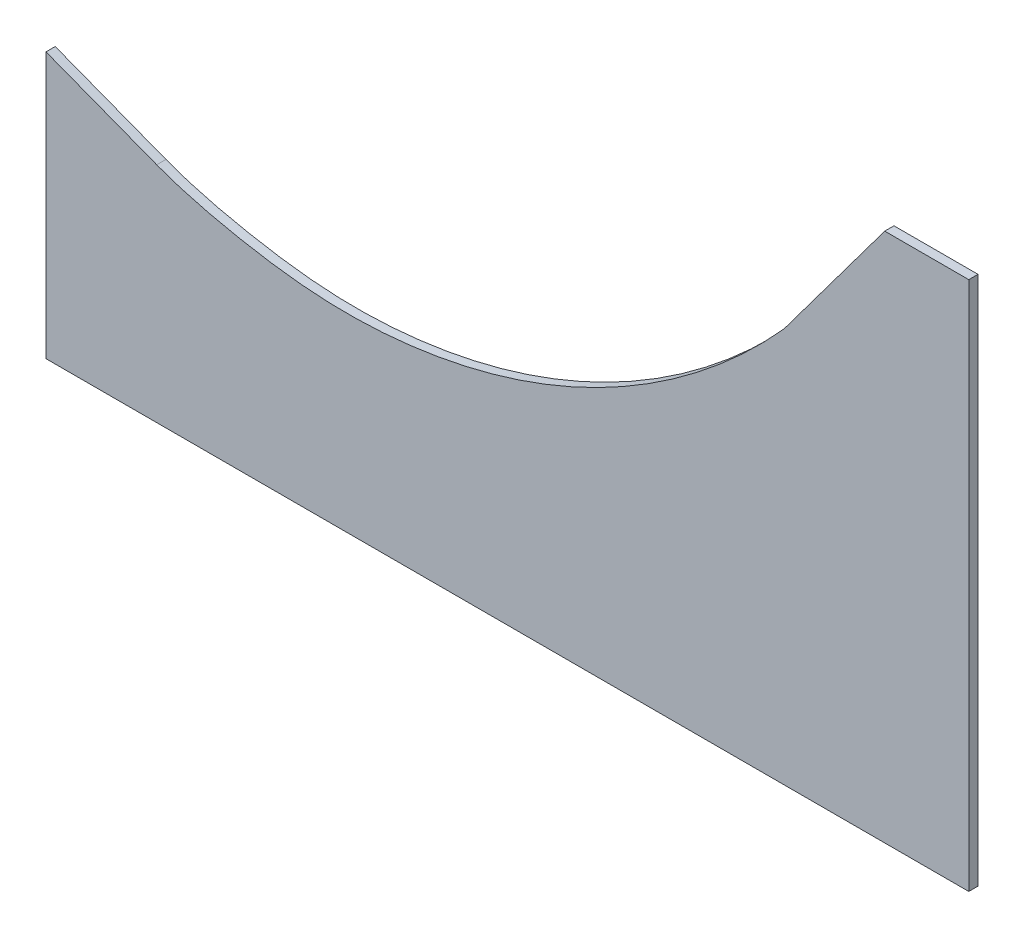
ISO-10303-21;
HEADER;
FILE_DESCRIPTION(('STEP AP214'),'2;1');
FILE_NAME('part.step','',(''),(''),'','','');
FILE_SCHEMA(('AUTOMOTIVE_DESIGN { 1 0 10303 214 1 1 1 1 }'));
ENDSEC;
DATA;
#1=APPLICATION_CONTEXT('core data for automotive mechanical design processes');
#2=APPLICATION_PROTOCOL_DEFINITION('international standard','automotive_design',2000,#1);
#3=PRODUCT_CONTEXT('',#1,'mechanical');
#4=PRODUCT('Part','Part','',(#3));
#5=PRODUCT_RELATED_PRODUCT_CATEGORY('part','',(#4));
#6=PRODUCT_DEFINITION_FORMATION('','',#4);
#7=PRODUCT_DEFINITION_CONTEXT('part definition',#1,'design');
#8=PRODUCT_DEFINITION('design','',#6,#7);
#9=PRODUCT_DEFINITION_SHAPE('','',#8);
#10=(LENGTH_UNIT() NAMED_UNIT(*) SI_UNIT(.MILLI.,.METRE.));
#11=(NAMED_UNIT(*) PLANE_ANGLE_UNIT() SI_UNIT($,.RADIAN.));
#12=(NAMED_UNIT(*) SI_UNIT($,.STERADIAN.) SOLID_ANGLE_UNIT());
#13=UNCERTAINTY_MEASURE_WITH_UNIT(LENGTH_MEASURE(1.E-05),#10,'distance_accuracy_value','');
#14=(GEOMETRIC_REPRESENTATION_CONTEXT(3) GLOBAL_UNCERTAINTY_ASSIGNED_CONTEXT((#13)) GLOBAL_UNIT_ASSIGNED_CONTEXT((#10,
#11,#12)) REPRESENTATION_CONTEXT('',''));
#15=CARTESIAN_POINT('',(0.,0.,0.));
#16=DIRECTION('',(0.,0.,1.));
#17=DIRECTION('',(1.,0.,0.));
#18=AXIS2_PLACEMENT_3D('',#15,#16,#17);
#19=CARTESIAN_POINT('',(49.9999999999998,42.8155305808905,1.));
#20=CARTESIAN_POINT('',(44.3505665601917,36.4903735097181,1.));
#21=CARTESIAN_POINT('',(34.6777739625909,28.8766328670857,1.));
#22=CARTESIAN_POINT('',(20.2670057495523,22.994551548607,1.));
#23=CARTESIAN_POINT('',(10.1152359153763,20.781402630503,1.));
#24=CARTESIAN_POINT('',(-0.0498420804016457,20.3048796551483,1.));
#25=CARTESIAN_POINT('',(-9.4392265766226,21.7094417449339,1.));
#26=CARTESIAN_POINT('',(-15.4209870859908,23.214894317329,1.));
#27=CARTESIAN_POINT('',(-18.,24.2027454218463,1.));
#28=B_SPLINE_CURVE_WITH_KNOTS('',3,(#19,#20,#21,#22,#23,#24,#25,#26,#27),.UNSPECIFIED.,.F.,.F.,
(4,1,1,1,1,1,4),(0.,0.339652846614818,0.483846426196113,0.620565765942941,0.754274515035132,
0.889069292186729,1.),.UNSPECIFIED.);
#29=DIRECTION('',(0.,0.,-1.));
#30=VECTOR('',#29,1.);
#31=SURFACE_OF_LINEAR_EXTRUSION('',#28,#30);
#32=CARTESIAN_POINT('',(49.9999999999998,42.8155305808905,0.));
#33=CARTESIAN_POINT('',(44.3505665601917,36.4903735097181,0.));
#34=CARTESIAN_POINT('',(34.6777739625909,28.8766328670857,0.));
#35=CARTESIAN_POINT('',(20.2670057495523,22.994551548607,0.));
#36=CARTESIAN_POINT('',(10.1152359153763,20.781402630503,0.));
#37=CARTESIAN_POINT('',(-0.0498420804016457,20.3048796551483,0.));
#38=CARTESIAN_POINT('',(-9.4392265766226,21.7094417449339,0.));
#39=CARTESIAN_POINT('',(-15.4209870859908,23.214894317329,0.));
#40=CARTESIAN_POINT('',(-18.,24.2027454218463,0.));
#41=B_SPLINE_CURVE_WITH_KNOTS('',3,(#32,#33,#34,#35,#36,#37,#38,#39,#40),.UNSPECIFIED.,.F.,.F.,
(4,1,1,1,1,1,4),(0.,0.339652846614818,0.483846426196113,0.620565765942941,0.754274515035132,
0.889069292186729,1.),.UNSPECIFIED.);
#42=CARTESIAN_POINT('',(49.9999999999997,42.8155305808905,0.));
#43=VERTEX_POINT('',#42);
#44=CARTESIAN_POINT('',(-18.,24.2027454218463,0.));
#45=VERTEX_POINT('',#44);
#46=EDGE_CURVE('E124',#43,#45,#41,.T.);
#47=ORIENTED_EDGE('',*,*,#46,.T.);
#48=DIRECTION('',(0.,0.,-1.));
#49=VECTOR('',#48,1.);
#50=CARTESIAN_POINT('',(-18.,24.2027454218463,1.));
#51=LINE('',#50,#49);
#52=CARTESIAN_POINT('',(-18.,24.2027454218463,1.));
#53=VERTEX_POINT('',#52);
#54=EDGE_CURVE('E11',#53,#45,#51,.T.);
#55=ORIENTED_EDGE('',*,*,#54,.F.);
#56=CARTESIAN_POINT('',(49.9999999999997,42.8155305808905,1.));
#57=VERTEX_POINT('',#56);
#58=EDGE_CURVE('E141',#57,#53,#28,.T.);
#59=ORIENTED_EDGE('',*,*,#58,.F.);
#60=DIRECTION('',(0.,0.,-1.));
#61=VECTOR('',#60,1.);
#62=CARTESIAN_POINT('',(49.9999999999997,42.8155305808905,1.));
#63=LINE('',#62,#61);
#64=EDGE_CURVE('E120',#57,#43,#63,.T.);
#65=ORIENTED_EDGE('',*,*,#64,.T.);
#66=EDGE_LOOP('',(#47,#55,#59,#65));
#67=FACE_BOUND('',#66,.T.);
#68=ADVANCED_FACE('F33',(#67),#31,.F.);
#69=CARTESIAN_POINT('',(-18.,24.2027454218463,1.));
#70=DIRECTION('',(-0.357692747742505,-0.933839332118977,0.));
#71=DIRECTION('',(0.933839332118977,-0.357692747742505,0.));
#72=AXIS2_PLACEMENT_3D('',#69,#70,#71);
#73=PLANE('',#72);
#74=DIRECTION('',(-0.933839332118977,0.357692747742505,0.));
#75=VECTOR('',#74,1.);
#76=CARTESIAN_POINT('',(-18.,24.2027454218463,0.));
#77=LINE('',#76,#75);
#78=CARTESIAN_POINT('',(-30.,28.799160271037,0.));
#79=VERTEX_POINT('',#78);
#80=EDGE_CURVE('E129',#45,#79,#77,.T.);
#81=ORIENTED_EDGE('',*,*,#80,.T.);
#82=DIRECTION('',(0.,0.,-1.));
#83=VECTOR('',#82,1.);
#84=CARTESIAN_POINT('',(-30.,28.799160271037,1.));
#85=LINE('',#84,#83);
#86=CARTESIAN_POINT('',(-30.,28.799160271037,1.));
#87=VERTEX_POINT('',#86);
#88=EDGE_CURVE('E42',#87,#79,#85,.T.);
#89=ORIENTED_EDGE('',*,*,#88,.F.);
#90=DIRECTION('',(-0.933839332118977,0.357692747742505,0.));
#91=VECTOR('',#90,1.);
#92=CARTESIAN_POINT('',(-18.,24.2027454218463,1.));
#93=LINE('',#92,#91);
#94=EDGE_CURVE('E90',#53,#87,#93,.T.);
#95=ORIENTED_EDGE('',*,*,#94,.F.);
#96=ORIENTED_EDGE('',*,*,#54,.T.);
#97=EDGE_LOOP('',(#81,#89,#95,#96));
#98=FACE_BOUND('',#97,.T.);
#99=ADVANCED_FACE('F171',(#98),#73,.F.);
#100=CARTESIAN_POINT('',(-30.,0.,1.));
#101=DIRECTION('',(1.,0.,0.));
#102=DIRECTION('',(0.,0.,-1.));
#103=AXIS2_PLACEMENT_3D('',#100,#101,#102);
#104=PLANE('',#103);
#105=DIRECTION('',(0.,-1.,0.));
#106=VECTOR('',#105,1.);
#107=CARTESIAN_POINT('',(-30.,0.,0.));
#108=LINE('',#107,#106);
#109=CARTESIAN_POINT('',(-30.,0.,0.));
#110=VERTEX_POINT('',#109);
#111=EDGE_CURVE('E134',#79,#110,#108,.T.);
#112=ORIENTED_EDGE('',*,*,#111,.T.);
#113=DIRECTION('',(0.,0.,-1.));
#114=VECTOR('',#113,1.);
#115=CARTESIAN_POINT('',(-30.,0.,1.));
#116=LINE('',#115,#114);
#117=CARTESIAN_POINT('',(-30.,0.,1.));
#118=VERTEX_POINT('',#117);
#119=EDGE_CURVE('E145',#118,#110,#116,.T.);
#120=ORIENTED_EDGE('',*,*,#119,.F.);
#121=DIRECTION('',(0.,-1.,0.));
#122=VECTOR('',#121,1.);
#123=CARTESIAN_POINT('',(-30.,0.,1.));
#124=LINE('',#123,#122);
#125=EDGE_CURVE('E153',#87,#118,#124,.T.);
#126=ORIENTED_EDGE('',*,*,#125,.F.);
#127=ORIENTED_EDGE('',*,*,#88,.T.);
#128=EDGE_LOOP('',(#112,#120,#126,#127));
#129=FACE_BOUND('',#128,.T.);
#130=ADVANCED_FACE('F151',(#129),#104,.F.);
#131=CARTESIAN_POINT('',(70.,0.,1.));
#132=DIRECTION('',(0.,1.,0.));
#133=DIRECTION('',(0.,0.,1.));
#134=AXIS2_PLACEMENT_3D('',#131,#132,#133);
#135=PLANE('',#134);
#136=DIRECTION('',(1.,0.,0.));
#137=VECTOR('',#136,1.);
#138=CARTESIAN_POINT('',(70.,0.,0.));
#139=LINE('',#138,#137);
#140=CARTESIAN_POINT('',(70.,0.,0.));
#141=VERTEX_POINT('',#140);
#142=EDGE_CURVE('E136',#110,#141,#139,.T.);
#143=ORIENTED_EDGE('',*,*,#142,.T.);
#144=DIRECTION('',(0.,0.,-1.));
#145=VECTOR('',#144,1.);
#146=CARTESIAN_POINT('',(70.,0.,1.));
#147=LINE('',#146,#145);
#148=CARTESIAN_POINT('',(70.,0.,1.));
#149=VERTEX_POINT('',#148);
#150=EDGE_CURVE('E115',#149,#141,#147,.T.);
#151=ORIENTED_EDGE('',*,*,#150,.F.);
#152=DIRECTION('',(1.,0.,0.));
#153=VECTOR('',#152,1.);
#154=CARTESIAN_POINT('',(70.,0.,1.));
#155=LINE('',#154,#153);
#156=EDGE_CURVE('E106',#118,#149,#155,.T.);
#157=ORIENTED_EDGE('',*,*,#156,.F.);
#158=ORIENTED_EDGE('',*,*,#119,.T.);
#159=EDGE_LOOP('',(#143,#151,#157,#158));
#160=FACE_BOUND('',#159,.T.);
#161=ADVANCED_FACE('F159',(#160),#135,.F.);
#162=CARTESIAN_POINT('',(70.,0.,1.));
#163=DIRECTION('',(-1.,0.,0.));
#164=DIRECTION('',(0.,0.,1.));
#165=AXIS2_PLACEMENT_3D('',#162,#163,#164);
#166=PLANE('',#165);
#167=DIRECTION('',(0.,1.,0.));
#168=VECTOR('',#167,1.);
#169=CARTESIAN_POINT('',(70.,0.,0.));
#170=LINE('',#169,#168);
#171=CARTESIAN_POINT('',(70.,57.421257864839,0.));
#172=VERTEX_POINT('',#171);
#173=EDGE_CURVE('E114',#141,#172,#170,.T.);
#174=ORIENTED_EDGE('',*,*,#173,.T.);
#175=DIRECTION('',(0.,0.,-1.));
#176=VECTOR('',#175,1.);
#177=CARTESIAN_POINT('',(70.,57.421257864839,1.));
#178=LINE('',#177,#176);
#179=CARTESIAN_POINT('',(70.,57.421257864839,1.));
#180=VERTEX_POINT('',#179);
#181=EDGE_CURVE('E111',#180,#172,#178,.T.);
#182=ORIENTED_EDGE('',*,*,#181,.F.);
#183=DIRECTION('',(0.,1.,0.));
#184=VECTOR('',#183,1.);
#185=CARTESIAN_POINT('',(70.,0.,1.));
#186=LINE('',#185,#184);
#187=EDGE_CURVE('E100',#149,#180,#186,.T.);
#188=ORIENTED_EDGE('',*,*,#187,.F.);
#189=ORIENTED_EDGE('',*,*,#150,.T.);
#190=EDGE_LOOP('',(#174,#182,#188,#189));
#191=FACE_BOUND('',#190,.T.);
#192=ADVANCED_FACE('F112',(#191),#166,.F.);
#193=CARTESIAN_POINT('',(70.,57.421257864839,1.));
#194=DIRECTION('',(0.,-1.,0.));
#195=DIRECTION('',(0.,0.,-1.));
#196=AXIS2_PLACEMENT_3D('',#193,#194,#195);
#197=PLANE('',#196);
#198=DIRECTION('',(-1.,0.,0.));
#199=VECTOR('',#198,1.);
#200=CARTESIAN_POINT('',(70.,57.421257864839,0.));
#201=LINE('',#200,#199);
#202=CARTESIAN_POINT('',(60.8931246882933,57.421257864839,0.));
#203=VERTEX_POINT('',#202);
#204=EDGE_CURVE('E76',#172,#203,#201,.T.);
#205=ORIENTED_EDGE('',*,*,#204,.T.);
#206=DIRECTION('',(0.,0.,-1.));
#207=VECTOR('',#206,1.);
#208=CARTESIAN_POINT('',(60.8931246882933,57.421257864839,1.));
#209=LINE('',#208,#207);
#210=CARTESIAN_POINT('',(60.8931246882933,57.421257864839,1.));
#211=VERTEX_POINT('',#210);
#212=EDGE_CURVE('E116',#211,#203,#209,.T.);
#213=ORIENTED_EDGE('',*,*,#212,.F.);
#214=DIRECTION('',(-1.,0.,0.));
#215=VECTOR('',#214,1.);
#216=CARTESIAN_POINT('',(70.,57.421257864839,1.));
#217=LINE('',#216,#215);
#218=EDGE_CURVE('E104',#180,#211,#217,.T.);
#219=ORIENTED_EDGE('',*,*,#218,.F.);
#220=ORIENTED_EDGE('',*,*,#181,.T.);
#221=EDGE_LOOP('',(#205,#213,#219,#220));
#222=FACE_BOUND('',#221,.T.);
#223=ADVANCED_FACE('F118',(#222),#197,.F.);
#224=CARTESIAN_POINT('',(60.8931246882933,57.421257864839,1.));
#225=DIRECTION('',(0.801608592643259,-0.597849198544662,0.));
#226=DIRECTION('',(0.597849198544662,0.801608592643259,0.));
#227=AXIS2_PLACEMENT_3D('',#224,#225,#226);
#228=PLANE('',#227);
#229=DIRECTION('',(-0.597849198544662,-0.801608592643259,0.));
#230=VECTOR('',#229,1.);
#231=CARTESIAN_POINT('',(60.8931246882933,57.421257864839,0.));
#232=LINE('',#231,#230);
#233=EDGE_CURVE('E82',#203,#43,#232,.T.);
#234=ORIENTED_EDGE('',*,*,#233,.T.);
#235=ORIENTED_EDGE('',*,*,#64,.F.);
#236=DIRECTION('',(-0.597849198544662,-0.801608592643259,0.));
#237=VECTOR('',#236,1.);
#238=CARTESIAN_POINT('',(60.8931246882933,57.421257864839,1.));
#239=LINE('',#238,#237);
#240=EDGE_CURVE('E50',#211,#57,#239,.T.);
#241=ORIENTED_EDGE('',*,*,#240,.F.);
#242=ORIENTED_EDGE('',*,*,#212,.T.);
#243=EDGE_LOOP('',(#234,#235,#241,#242));
#244=FACE_BOUND('',#243,.T.);
#245=ADVANCED_FACE('F185',(#244),#228,.F.);
#246=CARTESIAN_POINT('',(18.8397948825531,22.8854133187922,1.));
#247=DIRECTION('',(0.,0.,-1.));
#248=DIRECTION('',(-1.,0.,0.));
#249=AXIS2_PLACEMENT_3D('',#246,#247,#248);
#250=PLANE('',#249);
#251=ORIENTED_EDGE('',*,*,#58,.T.);
#252=ORIENTED_EDGE('',*,*,#94,.T.);
#253=ORIENTED_EDGE('',*,*,#125,.T.);
#254=ORIENTED_EDGE('',*,*,#156,.T.);
#255=ORIENTED_EDGE('',*,*,#187,.T.);
#256=ORIENTED_EDGE('',*,*,#218,.T.);
#257=ORIENTED_EDGE('',*,*,#240,.T.);
#258=EDGE_LOOP('',(#251,#252,#253,#254,#255,#256,#257));
#259=FACE_BOUND('',#258,.T.);
#260=ADVANCED_FACE('F102',(#259),#250,.F.);
#261=CARTESIAN_POINT('',(18.8397948825531,22.8854133187922,0.));
#262=DIRECTION('',(0.,0.,-1.));
#263=DIRECTION('',(-1.,0.,0.));
#264=AXIS2_PLACEMENT_3D('',#261,#262,#263);
#265=PLANE('',#264);
#266=ORIENTED_EDGE('',*,*,#46,.F.);
#267=ORIENTED_EDGE('',*,*,#233,.F.);
#268=ORIENTED_EDGE('',*,*,#204,.F.);
#269=ORIENTED_EDGE('',*,*,#173,.F.);
#270=ORIENTED_EDGE('',*,*,#142,.F.);
#271=ORIENTED_EDGE('',*,*,#111,.F.);
#272=ORIENTED_EDGE('',*,*,#80,.F.);
#273=EDGE_LOOP('',(#266,#267,#268,#269,#270,#271,#272));
#274=FACE_BOUND('',#273,.T.);
#275=ADVANCED_FACE('F157',(#274),#265,.T.);
#276=CLOSED_SHELL('',(#68,#99,#130,#161,#192,#223,#245,#260,#275));
#277=MANIFOLD_SOLID_BREP('B2',#276);
#278=ADVANCED_BREP_SHAPE_REPRESENTATION('',(#18,#277),#14);
#279=SHAPE_DEFINITION_REPRESENTATION(#9,#278);
ENDSEC;
END-ISO-10303-21;
